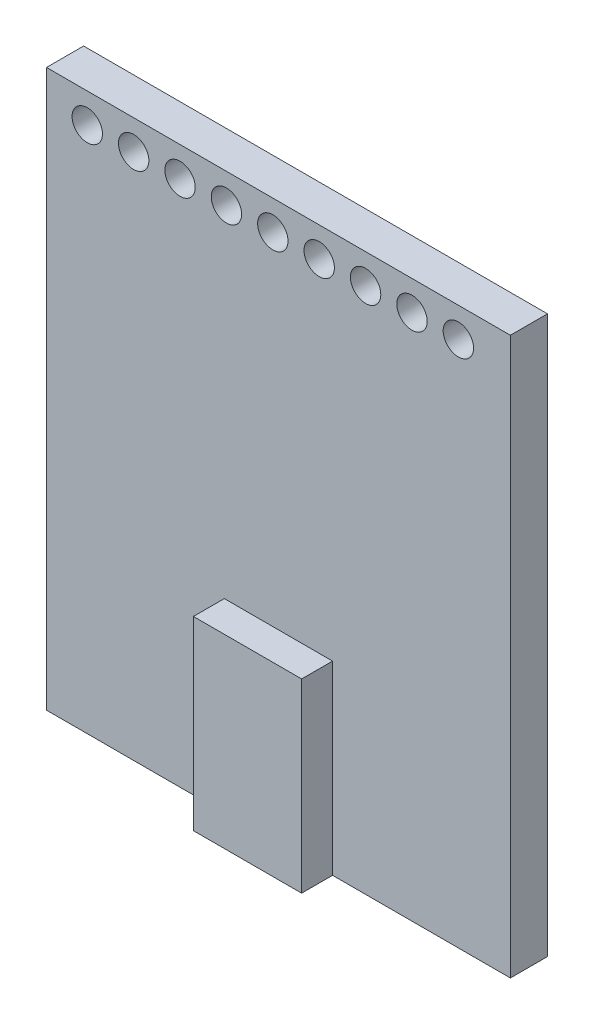
ISO-10303-21;
HEADER;
FILE_DESCRIPTION(('STEP AP214'),'2;1');
FILE_NAME('part.step','',(''),(''),'','','');
FILE_SCHEMA(('AUTOMOTIVE_DESIGN { 1 0 10303 214 1 1 1 1 }'));
ENDSEC;
DATA;
#1=APPLICATION_CONTEXT('core data for automotive mechanical design processes');
#2=APPLICATION_PROTOCOL_DEFINITION('international standard','automotive_design',2000,#1);
#3=PRODUCT_CONTEXT('',#1,'mechanical');
#4=PRODUCT('Part','Part','',(#3));
#5=PRODUCT_RELATED_PRODUCT_CATEGORY('part','',(#4));
#6=PRODUCT_DEFINITION_FORMATION('','',#4);
#7=PRODUCT_DEFINITION_CONTEXT('part definition',#1,'design');
#8=PRODUCT_DEFINITION('design','',#6,#7);
#9=PRODUCT_DEFINITION_SHAPE('','',#8);
#10=(LENGTH_UNIT() NAMED_UNIT(*) SI_UNIT(.MILLI.,.METRE.));
#11=(NAMED_UNIT(*) PLANE_ANGLE_UNIT() SI_UNIT($,.RADIAN.));
#12=(NAMED_UNIT(*) SI_UNIT($,.STERADIAN.) SOLID_ANGLE_UNIT());
#13=UNCERTAINTY_MEASURE_WITH_UNIT(LENGTH_MEASURE(1.E-05),#10,'distance_accuracy_value','');
#14=(GEOMETRIC_REPRESENTATION_CONTEXT(3) GLOBAL_UNCERTAINTY_ASSIGNED_CONTEXT((#13)) GLOBAL_UNIT_ASSIGNED_CONTEXT((#10,
#11,#12)) REPRESENTATION_CONTEXT('',''));
#15=CARTESIAN_POINT('',(0.,0.,0.));
#16=DIRECTION('',(0.,0.,1.));
#17=DIRECTION('',(1.,0.,0.));
#18=AXIS2_PLACEMENT_3D('',#15,#16,#17);
#19=CARTESIAN_POINT('',(7.5,9.,1.2));
#20=DIRECTION('',(-1.,0.,0.));
#21=DIRECTION('',(0.,-1.,0.));
#22=AXIS2_PLACEMENT_3D('',#19,#20,#21);
#23=PLANE('',#22);
#24=DIRECTION('',(0.,1.,0.));
#25=VECTOR('',#24,1.);
#26=CARTESIAN_POINT('',(7.5,9.,0.));
#27=LINE('',#26,#25);
#28=CARTESIAN_POINT('',(7.5,-9.,0.));
#29=VERTEX_POINT('',#28);
#30=CARTESIAN_POINT('',(7.5,9.,0.));
#31=VERTEX_POINT('',#30);
#32=EDGE_CURVE('E129',#29,#31,#27,.T.);
#33=ORIENTED_EDGE('',*,*,#32,.T.);
#34=DIRECTION('',(0.,0.,-1.));
#35=VECTOR('',#34,1.);
#36=CARTESIAN_POINT('',(7.5,9.,1.2));
#37=LINE('',#36,#35);
#38=CARTESIAN_POINT('',(7.5,9.,1.2));
#39=VERTEX_POINT('',#38);
#40=EDGE_CURVE('E11',#39,#31,#37,.T.);
#41=ORIENTED_EDGE('',*,*,#40,.F.);
#42=DIRECTION('',(0.,1.,0.));
#43=VECTOR('',#42,1.);
#44=CARTESIAN_POINT('',(7.5,9.,1.2));
#45=LINE('',#44,#43);
#46=CARTESIAN_POINT('',(7.5,-9.,1.2));
#47=VERTEX_POINT('',#46);
#48=EDGE_CURVE('E140',#47,#39,#45,.T.);
#49=ORIENTED_EDGE('',*,*,#48,.F.);
#50=DIRECTION('',(0.,0.,-1.));
#51=VECTOR('',#50,1.);
#52=CARTESIAN_POINT('',(7.5,-9.,1.2));
#53=LINE('',#52,#51);
#54=EDGE_CURVE('E154',#47,#29,#53,.T.);
#55=ORIENTED_EDGE('',*,*,#54,.T.);
#56=EDGE_LOOP('',(#33,#41,#49,#55));
#57=FACE_BOUND('',#56,.T.);
#58=ADVANCED_FACE('F39',(#57),#23,.F.);
#59=CARTESIAN_POINT('',(-7.5,9.,1.2));
#60=DIRECTION('',(0.,-1.,0.));
#61=DIRECTION('',(0.,0.,-1.));
#62=AXIS2_PLACEMENT_3D('',#59,#60,#61);
#63=PLANE('',#62);
#64=DIRECTION('',(-1.,0.,0.));
#65=VECTOR('',#64,1.);
#66=CARTESIAN_POINT('',(-7.5,9.,0.));
#67=LINE('',#66,#65);
#68=CARTESIAN_POINT('',(-7.5,9.,0.));
#69=VERTEX_POINT('',#68);
#70=EDGE_CURVE('E134',#31,#69,#67,.T.);
#71=ORIENTED_EDGE('',*,*,#70,.T.);
#72=DIRECTION('',(0.,0.,-1.));
#73=VECTOR('',#72,1.);
#74=CARTESIAN_POINT('',(-7.5,9.,1.2));
#75=LINE('',#74,#73);
#76=CARTESIAN_POINT('',(-7.5,9.,1.2));
#77=VERTEX_POINT('',#76);
#78=EDGE_CURVE('E47',#77,#69,#75,.T.);
#79=ORIENTED_EDGE('',*,*,#78,.F.);
#80=DIRECTION('',(-1.,0.,0.));
#81=VECTOR('',#80,1.);
#82=CARTESIAN_POINT('',(-7.5,9.,1.2));
#83=LINE('',#82,#81);
#84=EDGE_CURVE('E144',#39,#77,#83,.T.);
#85=ORIENTED_EDGE('',*,*,#84,.F.);
#86=ORIENTED_EDGE('',*,*,#40,.T.);
#87=EDGE_LOOP('',(#71,#79,#85,#86));
#88=FACE_BOUND('',#87,.T.);
#89=ADVANCED_FACE('F219',(#88),#63,.F.);
#90=CARTESIAN_POINT('',(-7.5,9.,1.2));
#91=DIRECTION('',(1.,0.,0.));
#92=DIRECTION('',(0.,1.,0.));
#93=AXIS2_PLACEMENT_3D('',#90,#91,#92);
#94=PLANE('',#93);
#95=DIRECTION('',(0.,-1.,0.));
#96=VECTOR('',#95,1.);
#97=CARTESIAN_POINT('',(-7.5,9.,0.));
#98=LINE('',#97,#96);
#99=CARTESIAN_POINT('',(-7.5,-9.,0.));
#100=VERTEX_POINT('',#99);
#101=EDGE_CURVE('E158',#69,#100,#98,.T.);
#102=ORIENTED_EDGE('',*,*,#101,.T.);
#103=DIRECTION('',(0.,0.,-1.));
#104=VECTOR('',#103,1.);
#105=CARTESIAN_POINT('',(-7.5,-9.,1.2));
#106=LINE('',#105,#104);
#107=CARTESIAN_POINT('',(-7.5,-9.,1.2));
#108=VERTEX_POINT('',#107);
#109=EDGE_CURVE('E166',#108,#100,#106,.T.);
#110=ORIENTED_EDGE('',*,*,#109,.F.);
#111=DIRECTION('',(0.,-1.,0.));
#112=VECTOR('',#111,1.);
#113=CARTESIAN_POINT('',(-7.5,9.,1.2));
#114=LINE('',#113,#112);
#115=EDGE_CURVE('E148',#77,#108,#114,.T.);
#116=ORIENTED_EDGE('',*,*,#115,.F.);
#117=ORIENTED_EDGE('',*,*,#78,.T.);
#118=EDGE_LOOP('',(#102,#110,#116,#117));
#119=FACE_BOUND('',#118,.T.);
#120=ADVANCED_FACE('F175',(#119),#94,.F.);
#121=CARTESIAN_POINT('',(-7.5,-9.,1.2));
#122=DIRECTION('',(0.,1.,0.));
#123=DIRECTION('',(0.,0.,1.));
#124=AXIS2_PLACEMENT_3D('',#121,#122,#123);
#125=PLANE('',#124);
#126=DIRECTION('',(1.,0.,0.));
#127=VECTOR('',#126,1.);
#128=CARTESIAN_POINT('',(-7.5,-9.,0.));
#129=LINE('',#128,#127);
#130=EDGE_CURVE('E145',#100,#29,#129,.T.);
#131=ORIENTED_EDGE('',*,*,#130,.T.);
#132=ORIENTED_EDGE('',*,*,#54,.F.);
#133=DIRECTION('',(1.,0.,0.));
#134=VECTOR('',#133,1.);
#135=CARTESIAN_POINT('',(-7.5,-9.,1.2));
#136=LINE('',#135,#134);
#137=CARTESIAN_POINT('',(1.75,-9.,1.2));
#138=VERTEX_POINT('',#137);
#139=EDGE_CURVE('E151',#138,#47,#136,.T.);
#140=ORIENTED_EDGE('',*,*,#139,.F.);
#141=DIRECTION('',(0.,0.,-1.));
#142=VECTOR('',#141,1.);
#143=CARTESIAN_POINT('',(1.75,-9.,2.2));
#144=LINE('',#143,#142);
#145=CARTESIAN_POINT('',(1.75,-9.,2.2));
#146=VERTEX_POINT('',#145);
#147=EDGE_CURVE('E110',#146,#138,#144,.T.);
#148=ORIENTED_EDGE('',*,*,#147,.F.);
#149=DIRECTION('',(1.,0.,0.));
#150=VECTOR('',#149,1.);
#151=CARTESIAN_POINT('',(-1.75,-9.,2.2));
#152=LINE('',#151,#150);
#153=CARTESIAN_POINT('',(-1.75,-9.,2.2));
#154=VERTEX_POINT('',#153);
#155=EDGE_CURVE('E103',#154,#146,#152,.T.);
#156=ORIENTED_EDGE('',*,*,#155,.F.);
#157=DIRECTION('',(0.,0.,-1.));
#158=VECTOR('',#157,1.);
#159=CARTESIAN_POINT('',(-1.75,-9.,2.2));
#160=LINE('',#159,#158);
#161=CARTESIAN_POINT('',(-1.75,-9.,1.2));
#162=VERTEX_POINT('',#161);
#163=EDGE_CURVE('E108',#154,#162,#160,.T.);
#164=ORIENTED_EDGE('',*,*,#163,.T.);
#165=EDGE_CURVE('E152',#108,#162,#136,.T.);
#166=ORIENTED_EDGE('',*,*,#165,.F.);
#167=ORIENTED_EDGE('',*,*,#109,.T.);
#168=EDGE_LOOP('',(#131,#132,#140,#148,#156,#164,#166,#167));
#169=FACE_BOUND('',#168,.T.);
#170=ADVANCED_FACE('F105',(#169),#125,.F.);
#171=CARTESIAN_POINT('',(0.,0.,1.2));
#172=DIRECTION('',(0.,0.,1.));
#173=DIRECTION('',(1.,0.,0.));
#174=AXIS2_PLACEMENT_3D('',#171,#172,#173);
#175=PLANE('',#174);
#176=CARTESIAN_POINT('',(-6.18190724480883,8.04141873814679,1.2));
#177=DIRECTION('',(0.,0.,1.));
#178=DIRECTION('',(1.,0.,0.));
#179=AXIS2_PLACEMENT_3D('',#176,#177,#178);
#180=CIRCLE('',#179,0.491511220984585);
#181=CARTESIAN_POINT('',(-5.69039602382424,8.04141873814679,1.2));
#182=VERTEX_POINT('',#181);
#183=EDGE_CURVE('E449',#182,#182,#180,.T.);
#184=ORIENTED_EDGE('',*,*,#183,.F.);
#185=EDGE_LOOP('',(#184));
#186=FACE_BOUND('',#185,.T.);
#187=CARTESIAN_POINT('',(-4.68190724480883,8.04141873814679,1.2));
#188=DIRECTION('',(0.,0.,1.));
#189=DIRECTION('',(1.,0.,0.));
#190=AXIS2_PLACEMENT_3D('',#187,#188,#189);
#191=CIRCLE('',#190,0.491511220984585);
#192=CARTESIAN_POINT('',(-4.19039602382424,8.04141873814679,1.2));
#193=VERTEX_POINT('',#192);
#194=EDGE_CURVE('E459',#193,#193,#191,.T.);
#195=ORIENTED_EDGE('',*,*,#194,.F.);
#196=EDGE_LOOP('',(#195));
#197=FACE_BOUND('',#196,.T.);
#198=CARTESIAN_POINT('',(-3.18190724480883,8.04141873814679,1.2));
#199=DIRECTION('',(0.,0.,1.));
#200=DIRECTION('',(1.,0.,0.));
#201=AXIS2_PLACEMENT_3D('',#198,#199,#200);
#202=CIRCLE('',#201,0.491511220984585);
#203=CARTESIAN_POINT('',(-2.69039602382424,8.04141873814679,1.2));
#204=VERTEX_POINT('',#203);
#205=EDGE_CURVE('E467',#204,#204,#202,.T.);
#206=ORIENTED_EDGE('',*,*,#205,.F.);
#207=EDGE_LOOP('',(#206));
#208=FACE_BOUND('',#207,.T.);
#209=CARTESIAN_POINT('',(-1.68190724480883,8.04141873814679,1.2));
#210=DIRECTION('',(0.,0.,1.));
#211=DIRECTION('',(1.,0.,0.));
#212=AXIS2_PLACEMENT_3D('',#209,#210,#211);
#213=CIRCLE('',#212,0.491511220984585);
#214=CARTESIAN_POINT('',(-1.19039602382424,8.04141873814679,1.2));
#215=VERTEX_POINT('',#214);
#216=EDGE_CURVE('E475',#215,#215,#213,.T.);
#217=ORIENTED_EDGE('',*,*,#216,.F.);
#218=EDGE_LOOP('',(#217));
#219=FACE_BOUND('',#218,.T.);
#220=CARTESIAN_POINT('',(-0.181907244808826,8.04141873814679,1.2));
#221=DIRECTION('',(0.,0.,1.));
#222=DIRECTION('',(1.,0.,0.));
#223=AXIS2_PLACEMENT_3D('',#220,#221,#222);
#224=CIRCLE('',#223,0.491511220984585);
#225=CARTESIAN_POINT('',(0.309603976175758,8.04141873814679,1.2));
#226=VERTEX_POINT('',#225);
#227=EDGE_CURVE('E483',#226,#226,#224,.T.);
#228=ORIENTED_EDGE('',*,*,#227,.F.);
#229=EDGE_LOOP('',(#228));
#230=FACE_BOUND('',#229,.T.);
#231=CARTESIAN_POINT('',(1.31809275519117,8.04141873814679,1.2));
#232=DIRECTION('',(0.,0.,1.));
#233=DIRECTION('',(1.,0.,0.));
#234=AXIS2_PLACEMENT_3D('',#231,#232,#233);
#235=CIRCLE('',#234,0.491511220984585);
#236=CARTESIAN_POINT('',(1.80960397617576,8.04141873814679,1.2));
#237=VERTEX_POINT('',#236);
#238=EDGE_CURVE('E491',#237,#237,#235,.T.);
#239=ORIENTED_EDGE('',*,*,#238,.F.);
#240=EDGE_LOOP('',(#239));
#241=FACE_BOUND('',#240,.T.);
#242=CARTESIAN_POINT('',(2.81809275519117,8.04141873814679,1.2));
#243=DIRECTION('',(0.,0.,1.));
#244=DIRECTION('',(1.,0.,0.));
#245=AXIS2_PLACEMENT_3D('',#242,#243,#244);
#246=CIRCLE('',#245,0.491511220984585);
#247=CARTESIAN_POINT('',(3.30960397617576,8.04141873814679,1.2));
#248=VERTEX_POINT('',#247);
#249=EDGE_CURVE('E499',#248,#248,#246,.T.);
#250=ORIENTED_EDGE('',*,*,#249,.F.);
#251=EDGE_LOOP('',(#250));
#252=FACE_BOUND('',#251,.T.);
#253=CARTESIAN_POINT('',(4.31809275519117,8.04141873814679,1.2));
#254=DIRECTION('',(0.,0.,1.));
#255=DIRECTION('',(1.,0.,0.));
#256=AXIS2_PLACEMENT_3D('',#253,#254,#255);
#257=CIRCLE('',#256,0.491511220984585);
#258=CARTESIAN_POINT('',(4.80960397617576,8.04141873814679,1.2));
#259=VERTEX_POINT('',#258);
#260=EDGE_CURVE('E507',#259,#259,#257,.T.);
#261=ORIENTED_EDGE('',*,*,#260,.F.);
#262=EDGE_LOOP('',(#261));
#263=FACE_BOUND('',#262,.T.);
#264=CARTESIAN_POINT('',(5.81809275519117,8.04141873814679,1.2));
#265=DIRECTION('',(0.,0.,1.));
#266=DIRECTION('',(1.,0.,0.));
#267=AXIS2_PLACEMENT_3D('',#264,#265,#266);
#268=CIRCLE('',#267,0.491511220984585);
#269=CARTESIAN_POINT('',(6.30960397617576,8.04141873814679,1.2));
#270=VERTEX_POINT('',#269);
#271=EDGE_CURVE('E515',#270,#270,#268,.T.);
#272=ORIENTED_EDGE('',*,*,#271,.F.);
#273=EDGE_LOOP('',(#272));
#274=FACE_BOUND('',#273,.T.);
#275=DIRECTION('',(0.,-1.,0.));
#276=VECTOR('',#275,1.);
#277=CARTESIAN_POINT('',(-1.75,-9.,1.2));
#278=LINE('',#277,#276);
#279=CARTESIAN_POINT('',(-1.75,-3.,1.2));
#280=VERTEX_POINT('',#279);
#281=EDGE_CURVE('E54',#280,#162,#278,.T.);
#282=ORIENTED_EDGE('',*,*,#281,.F.);
#283=DIRECTION('',(-1.,0.,0.));
#284=VECTOR('',#283,1.);
#285=CARTESIAN_POINT('',(-1.75,-3.,1.2));
#286=LINE('',#285,#284);
#287=CARTESIAN_POINT('',(1.75,-3.,1.2));
#288=VERTEX_POINT('',#287);
#289=EDGE_CURVE('E125',#288,#280,#286,.T.);
#290=ORIENTED_EDGE('',*,*,#289,.F.);
#291=DIRECTION('',(0.,1.,0.));
#292=VECTOR('',#291,1.);
#293=CARTESIAN_POINT('',(1.75,-9.,1.2));
#294=LINE('',#293,#292);
#295=EDGE_CURVE('E60',#138,#288,#294,.T.);
#296=ORIENTED_EDGE('',*,*,#295,.F.);
#297=ORIENTED_EDGE('',*,*,#139,.T.);
#298=ORIENTED_EDGE('',*,*,#48,.T.);
#299=ORIENTED_EDGE('',*,*,#84,.T.);
#300=ORIENTED_EDGE('',*,*,#115,.T.);
#301=ORIENTED_EDGE('',*,*,#165,.T.);
#302=EDGE_LOOP('',(#282,#290,#296,#297,#298,#299,#300,#301));
#303=FACE_BOUND('',#302,.T.);
#304=ADVANCED_FACE('F186',(#186,#197,#208,#219,#230,#241,#252,#263,#274,#303),#175,.T.);
#305=CARTESIAN_POINT('',(0.,0.,0.));
#306=DIRECTION('',(0.,0.,1.));
#307=DIRECTION('',(1.,0.,0.));
#308=AXIS2_PLACEMENT_3D('',#305,#306,#307);
#309=PLANE('',#308);
#310=ORIENTED_EDGE('',*,*,#32,.F.);
#311=ORIENTED_EDGE('',*,*,#130,.F.);
#312=ORIENTED_EDGE('',*,*,#101,.F.);
#313=ORIENTED_EDGE('',*,*,#70,.F.);
#314=EDGE_LOOP('',(#310,#311,#312,#313));
#315=FACE_BOUND('',#314,.T.);
#316=ADVANCED_FACE('F181',(#315),#309,.F.);
#317=CARTESIAN_POINT('',(-1.75,-9.,2.2));
#318=DIRECTION('',(1.,0.,0.));
#319=DIRECTION('',(0.,0.,-1.));
#320=AXIS2_PLACEMENT_3D('',#317,#318,#319);
#321=PLANE('',#320);
#322=ORIENTED_EDGE('',*,*,#281,.T.);
#323=ORIENTED_EDGE('',*,*,#163,.F.);
#324=DIRECTION('',(0.,-1.,0.));
#325=VECTOR('',#324,1.);
#326=CARTESIAN_POINT('',(-1.75,-9.,2.2));
#327=LINE('',#326,#325);
#328=CARTESIAN_POINT('',(-1.75,-3.,2.2));
#329=VERTEX_POINT('',#328);
#330=EDGE_CURVE('E115',#329,#154,#327,.T.);
#331=ORIENTED_EDGE('',*,*,#330,.F.);
#332=DIRECTION('',(0.,0.,-1.));
#333=VECTOR('',#332,1.);
#334=CARTESIAN_POINT('',(-1.75,-3.,2.2));
#335=LINE('',#334,#333);
#336=EDGE_CURVE('E195',#329,#280,#335,.T.);
#337=ORIENTED_EDGE('',*,*,#336,.T.);
#338=EDGE_LOOP('',(#322,#323,#331,#337));
#339=FACE_BOUND('',#338,.T.);
#340=ADVANCED_FACE('F127',(#339),#321,.F.);
#341=CARTESIAN_POINT('',(1.75,-9.,2.2));
#342=DIRECTION('',(-1.,0.,0.));
#343=DIRECTION('',(0.,0.,1.));
#344=AXIS2_PLACEMENT_3D('',#341,#342,#343);
#345=PLANE('',#344);
#346=ORIENTED_EDGE('',*,*,#295,.T.);
#347=DIRECTION('',(0.,0.,-1.));
#348=VECTOR('',#347,1.);
#349=CARTESIAN_POINT('',(1.75,-3.,2.2));
#350=LINE('',#349,#348);
#351=CARTESIAN_POINT('',(1.75,-3.,2.2));
#352=VERTEX_POINT('',#351);
#353=EDGE_CURVE('E136',#352,#288,#350,.T.);
#354=ORIENTED_EDGE('',*,*,#353,.F.);
#355=DIRECTION('',(0.,1.,0.));
#356=VECTOR('',#355,1.);
#357=CARTESIAN_POINT('',(1.75,-9.,2.2));
#358=LINE('',#357,#356);
#359=EDGE_CURVE('E114',#146,#352,#358,.T.);
#360=ORIENTED_EDGE('',*,*,#359,.F.);
#361=ORIENTED_EDGE('',*,*,#147,.T.);
#362=EDGE_LOOP('',(#346,#354,#360,#361));
#363=FACE_BOUND('',#362,.T.);
#364=ADVANCED_FACE('F189',(#363),#345,.F.);
#365=CARTESIAN_POINT('',(-1.75,-3.,2.2));
#366=DIRECTION('',(0.,-1.,0.));
#367=DIRECTION('',(0.,0.,-1.));
#368=AXIS2_PLACEMENT_3D('',#365,#366,#367);
#369=PLANE('',#368);
#370=ORIENTED_EDGE('',*,*,#289,.T.);
#371=ORIENTED_EDGE('',*,*,#336,.F.);
#372=DIRECTION('',(-1.,0.,0.));
#373=VECTOR('',#372,1.);
#374=CARTESIAN_POINT('',(-1.75,-3.,2.2));
#375=LINE('',#374,#373);
#376=EDGE_CURVE('E120',#352,#329,#375,.T.);
#377=ORIENTED_EDGE('',*,*,#376,.F.);
#378=ORIENTED_EDGE('',*,*,#353,.T.);
#379=EDGE_LOOP('',(#370,#371,#377,#378));
#380=FACE_BOUND('',#379,.T.);
#381=ADVANCED_FACE('F208',(#380),#369,.F.);
#382=CARTESIAN_POINT('',(0.,0.,2.2));
#383=DIRECTION('',(0.,0.,-1.));
#384=DIRECTION('',(-1.,0.,0.));
#385=AXIS2_PLACEMENT_3D('',#382,#383,#384);
#386=PLANE('',#385);
#387=ORIENTED_EDGE('',*,*,#330,.T.);
#388=ORIENTED_EDGE('',*,*,#155,.T.);
#389=ORIENTED_EDGE('',*,*,#359,.T.);
#390=ORIENTED_EDGE('',*,*,#376,.T.);
#391=EDGE_LOOP('',(#387,#388,#389,#390));
#392=FACE_BOUND('',#391,.T.);
#393=ADVANCED_FACE('F118',(#392),#386,.F.);
#394=CARTESIAN_POINT('',(5.81809275519117,8.04141873814679,0.2));
#395=DIRECTION('',(0.,0.,1.));
#396=DIRECTION('',(1.,0.,0.));
#397=AXIS2_PLACEMENT_3D('',#394,#395,#396);
#398=CYLINDRICAL_SURFACE('',#397,0.491511220984585);
#399=CARTESIAN_POINT('',(5.81809275519117,8.04141873814679,0.2));
#400=DIRECTION('',(0.,0.,1.));
#401=DIRECTION('',(1.,0.,0.));
#402=AXIS2_PLACEMENT_3D('',#399,#400,#401);
#403=CIRCLE('',#402,0.491511220984585);
#404=CARTESIAN_POINT('',(6.30960397617576,8.04141873814679,0.2));
#405=VERTEX_POINT('',#404);
#406=EDGE_CURVE('E511',#405,#405,#403,.T.);
#407=ORIENTED_EDGE('',*,*,#406,.F.);
#408=EDGE_LOOP('',(#407));
#409=FACE_BOUND('',#408,.T.);
#410=ORIENTED_EDGE('',*,*,#271,.T.);
#411=EDGE_LOOP('',(#410));
#412=FACE_BOUND('',#411,.T.);
#413=ADVANCED_FACE('F215',(#409,#412),#398,.F.);
#414=CARTESIAN_POINT('',(5.81809275519117,8.04141873814679,0.2));
#415=DIRECTION('',(0.,0.,1.));
#416=DIRECTION('',(1.,0.,0.));
#417=AXIS2_PLACEMENT_3D('',#414,#415,#416);
#418=PLANE('',#417);
#419=ORIENTED_EDGE('',*,*,#406,.T.);
#420=EDGE_LOOP('',(#419));
#421=FACE_BOUND('',#420,.T.);
#422=ADVANCED_FACE('F272',(#421),#418,.T.);
#423=CARTESIAN_POINT('',(4.31809275519117,8.04141873814679,0.2));
#424=DIRECTION('',(0.,0.,1.));
#425=DIRECTION('',(1.,0.,0.));
#426=AXIS2_PLACEMENT_3D('',#423,#424,#425);
#427=CYLINDRICAL_SURFACE('',#426,0.491511220984585);
#428=CARTESIAN_POINT('',(4.31809275519117,8.04141873814679,0.2));
#429=DIRECTION('',(0.,0.,1.));
#430=DIRECTION('',(1.,0.,0.));
#431=AXIS2_PLACEMENT_3D('',#428,#429,#430);
#432=CIRCLE('',#431,0.491511220984585);
#433=CARTESIAN_POINT('',(4.80960397617576,8.04141873814679,0.2));
#434=VERTEX_POINT('',#433);
#435=EDGE_CURVE('E503',#434,#434,#432,.T.);
#436=ORIENTED_EDGE('',*,*,#435,.F.);
#437=EDGE_LOOP('',(#436));
#438=FACE_BOUND('',#437,.T.);
#439=ORIENTED_EDGE('',*,*,#260,.T.);
#440=EDGE_LOOP('',(#439));
#441=FACE_BOUND('',#440,.T.);
#442=ADVANCED_FACE('F282',(#438,#441),#427,.F.);
#443=CARTESIAN_POINT('',(4.31809275519117,8.04141873814679,0.2));
#444=DIRECTION('',(0.,0.,1.));
#445=DIRECTION('',(1.,0.,0.));
#446=AXIS2_PLACEMENT_3D('',#443,#444,#445);
#447=PLANE('',#446);
#448=ORIENTED_EDGE('',*,*,#435,.T.);
#449=EDGE_LOOP('',(#448));
#450=FACE_BOUND('',#449,.T.);
#451=ADVANCED_FACE('F292',(#450),#447,.T.);
#452=CARTESIAN_POINT('',(2.81809275519117,8.04141873814679,0.2));
#453=DIRECTION('',(0.,0.,1.));
#454=DIRECTION('',(1.,0.,0.));
#455=AXIS2_PLACEMENT_3D('',#452,#453,#454);
#456=CYLINDRICAL_SURFACE('',#455,0.491511220984585);
#457=CARTESIAN_POINT('',(2.81809275519117,8.04141873814679,0.2));
#458=DIRECTION('',(0.,0.,1.));
#459=DIRECTION('',(1.,0.,0.));
#460=AXIS2_PLACEMENT_3D('',#457,#458,#459);
#461=CIRCLE('',#460,0.491511220984585);
#462=CARTESIAN_POINT('',(3.30960397617576,8.04141873814679,0.2));
#463=VERTEX_POINT('',#462);
#464=EDGE_CURVE('E495',#463,#463,#461,.T.);
#465=ORIENTED_EDGE('',*,*,#464,.F.);
#466=EDGE_LOOP('',(#465));
#467=FACE_BOUND('',#466,.T.);
#468=ORIENTED_EDGE('',*,*,#249,.T.);
#469=EDGE_LOOP('',(#468));
#470=FACE_BOUND('',#469,.T.);
#471=ADVANCED_FACE('F302',(#467,#470),#456,.F.);
#472=CARTESIAN_POINT('',(2.81809275519117,8.04141873814679,0.2));
#473=DIRECTION('',(0.,0.,1.));
#474=DIRECTION('',(1.,0.,0.));
#475=AXIS2_PLACEMENT_3D('',#472,#473,#474);
#476=PLANE('',#475);
#477=ORIENTED_EDGE('',*,*,#464,.T.);
#478=EDGE_LOOP('',(#477));
#479=FACE_BOUND('',#478,.T.);
#480=ADVANCED_FACE('F312',(#479),#476,.T.);
#481=CARTESIAN_POINT('',(1.31809275519117,8.04141873814679,0.2));
#482=DIRECTION('',(0.,0.,1.));
#483=DIRECTION('',(1.,0.,0.));
#484=AXIS2_PLACEMENT_3D('',#481,#482,#483);
#485=CYLINDRICAL_SURFACE('',#484,0.491511220984585);
#486=CARTESIAN_POINT('',(1.31809275519117,8.04141873814679,0.2));
#487=DIRECTION('',(0.,0.,1.));
#488=DIRECTION('',(1.,0.,0.));
#489=AXIS2_PLACEMENT_3D('',#486,#487,#488);
#490=CIRCLE('',#489,0.491511220984585);
#491=CARTESIAN_POINT('',(1.80960397617576,8.04141873814679,0.2));
#492=VERTEX_POINT('',#491);
#493=EDGE_CURVE('E487',#492,#492,#490,.T.);
#494=ORIENTED_EDGE('',*,*,#493,.F.);
#495=EDGE_LOOP('',(#494));
#496=FACE_BOUND('',#495,.T.);
#497=ORIENTED_EDGE('',*,*,#238,.T.);
#498=EDGE_LOOP('',(#497));
#499=FACE_BOUND('',#498,.T.);
#500=ADVANCED_FACE('F322',(#496,#499),#485,.F.);
#501=CARTESIAN_POINT('',(1.31809275519117,8.04141873814679,0.2));
#502=DIRECTION('',(0.,0.,1.));
#503=DIRECTION('',(1.,0.,0.));
#504=AXIS2_PLACEMENT_3D('',#501,#502,#503);
#505=PLANE('',#504);
#506=ORIENTED_EDGE('',*,*,#493,.T.);
#507=EDGE_LOOP('',(#506));
#508=FACE_BOUND('',#507,.T.);
#509=ADVANCED_FACE('F332',(#508),#505,.T.);
#510=CARTESIAN_POINT('',(-0.181907244808826,8.04141873814679,0.2));
#511=DIRECTION('',(0.,0.,1.));
#512=DIRECTION('',(1.,0.,0.));
#513=AXIS2_PLACEMENT_3D('',#510,#511,#512);
#514=CYLINDRICAL_SURFACE('',#513,0.491511220984585);
#515=CARTESIAN_POINT('',(-0.181907244808826,8.04141873814679,0.2));
#516=DIRECTION('',(0.,0.,1.));
#517=DIRECTION('',(1.,0.,0.));
#518=AXIS2_PLACEMENT_3D('',#515,#516,#517);
#519=CIRCLE('',#518,0.491511220984585);
#520=CARTESIAN_POINT('',(0.309603976175758,8.04141873814679,0.2));
#521=VERTEX_POINT('',#520);
#522=EDGE_CURVE('E479',#521,#521,#519,.T.);
#523=ORIENTED_EDGE('',*,*,#522,.F.);
#524=EDGE_LOOP('',(#523));
#525=FACE_BOUND('',#524,.T.);
#526=ORIENTED_EDGE('',*,*,#227,.T.);
#527=EDGE_LOOP('',(#526));
#528=FACE_BOUND('',#527,.T.);
#529=ADVANCED_FACE('F342',(#525,#528),#514,.F.);
#530=CARTESIAN_POINT('',(-0.181907244808826,8.04141873814679,0.2));
#531=DIRECTION('',(0.,0.,1.));
#532=DIRECTION('',(1.,0.,0.));
#533=AXIS2_PLACEMENT_3D('',#530,#531,#532);
#534=PLANE('',#533);
#535=ORIENTED_EDGE('',*,*,#522,.T.);
#536=EDGE_LOOP('',(#535));
#537=FACE_BOUND('',#536,.T.);
#538=ADVANCED_FACE('F352',(#537),#534,.T.);
#539=CARTESIAN_POINT('',(-1.68190724480883,8.04141873814679,0.2));
#540=DIRECTION('',(0.,0.,1.));
#541=DIRECTION('',(1.,0.,0.));
#542=AXIS2_PLACEMENT_3D('',#539,#540,#541);
#543=CYLINDRICAL_SURFACE('',#542,0.491511220984585);
#544=CARTESIAN_POINT('',(-1.68190724480883,8.04141873814679,0.2));
#545=DIRECTION('',(0.,0.,1.));
#546=DIRECTION('',(1.,0.,0.));
#547=AXIS2_PLACEMENT_3D('',#544,#545,#546);
#548=CIRCLE('',#547,0.491511220984585);
#549=CARTESIAN_POINT('',(-1.19039602382424,8.04141873814679,0.2));
#550=VERTEX_POINT('',#549);
#551=EDGE_CURVE('E471',#550,#550,#548,.T.);
#552=ORIENTED_EDGE('',*,*,#551,.F.);
#553=EDGE_LOOP('',(#552));
#554=FACE_BOUND('',#553,.T.);
#555=ORIENTED_EDGE('',*,*,#216,.T.);
#556=EDGE_LOOP('',(#555));
#557=FACE_BOUND('',#556,.T.);
#558=ADVANCED_FACE('F362',(#554,#557),#543,.F.);
#559=CARTESIAN_POINT('',(-1.68190724480883,8.04141873814679,0.2));
#560=DIRECTION('',(0.,0.,1.));
#561=DIRECTION('',(1.,0.,0.));
#562=AXIS2_PLACEMENT_3D('',#559,#560,#561);
#563=PLANE('',#562);
#564=ORIENTED_EDGE('',*,*,#551,.T.);
#565=EDGE_LOOP('',(#564));
#566=FACE_BOUND('',#565,.T.);
#567=ADVANCED_FACE('F372',(#566),#563,.T.);
#568=CARTESIAN_POINT('',(-3.18190724480883,8.04141873814679,0.2));
#569=DIRECTION('',(0.,0.,1.));
#570=DIRECTION('',(1.,0.,0.));
#571=AXIS2_PLACEMENT_3D('',#568,#569,#570);
#572=CYLINDRICAL_SURFACE('',#571,0.491511220984585);
#573=CARTESIAN_POINT('',(-3.18190724480883,8.04141873814679,0.2));
#574=DIRECTION('',(0.,0.,1.));
#575=DIRECTION('',(1.,0.,0.));
#576=AXIS2_PLACEMENT_3D('',#573,#574,#575);
#577=CIRCLE('',#576,0.491511220984585);
#578=CARTESIAN_POINT('',(-2.69039602382424,8.04141873814679,0.2));
#579=VERTEX_POINT('',#578);
#580=EDGE_CURVE('E463',#579,#579,#577,.T.);
#581=ORIENTED_EDGE('',*,*,#580,.F.);
#582=EDGE_LOOP('',(#581));
#583=FACE_BOUND('',#582,.T.);
#584=ORIENTED_EDGE('',*,*,#205,.T.);
#585=EDGE_LOOP('',(#584));
#586=FACE_BOUND('',#585,.T.);
#587=ADVANCED_FACE('F382',(#583,#586),#572,.F.);
#588=CARTESIAN_POINT('',(-3.18190724480883,8.04141873814679,0.2));
#589=DIRECTION('',(0.,0.,1.));
#590=DIRECTION('',(1.,0.,0.));
#591=AXIS2_PLACEMENT_3D('',#588,#589,#590);
#592=PLANE('',#591);
#593=ORIENTED_EDGE('',*,*,#580,.T.);
#594=EDGE_LOOP('',(#593));
#595=FACE_BOUND('',#594,.T.);
#596=ADVANCED_FACE('F392',(#595),#592,.T.);
#597=CARTESIAN_POINT('',(-4.68190724480883,8.04141873814679,0.2));
#598=DIRECTION('',(0.,0.,1.));
#599=DIRECTION('',(1.,0.,0.));
#600=AXIS2_PLACEMENT_3D('',#597,#598,#599);
#601=CYLINDRICAL_SURFACE('',#600,0.491511220984585);
#602=CARTESIAN_POINT('',(-4.68190724480883,8.04141873814679,0.2));
#603=DIRECTION('',(0.,0.,1.));
#604=DIRECTION('',(1.,0.,0.));
#605=AXIS2_PLACEMENT_3D('',#602,#603,#604);
#606=CIRCLE('',#605,0.491511220984585);
#607=CARTESIAN_POINT('',(-4.19039602382424,8.04141873814679,0.2));
#608=VERTEX_POINT('',#607);
#609=EDGE_CURVE('E453',#608,#608,#606,.T.);
#610=ORIENTED_EDGE('',*,*,#609,.F.);
#611=EDGE_LOOP('',(#610));
#612=FACE_BOUND('',#611,.T.);
#613=ORIENTED_EDGE('',*,*,#194,.T.);
#614=EDGE_LOOP('',(#613));
#615=FACE_BOUND('',#614,.T.);
#616=ADVANCED_FACE('F402',(#612,#615),#601,.F.);
#617=CARTESIAN_POINT('',(-4.68190724480883,8.04141873814679,0.2));
#618=DIRECTION('',(0.,0.,1.));
#619=DIRECTION('',(1.,0.,0.));
#620=AXIS2_PLACEMENT_3D('',#617,#618,#619);
#621=PLANE('',#620);
#622=ORIENTED_EDGE('',*,*,#609,.T.);
#623=EDGE_LOOP('',(#622));
#624=FACE_BOUND('',#623,.T.);
#625=ADVANCED_FACE('F412',(#624),#621,.T.);
#626=CARTESIAN_POINT('',(-6.18190724480883,8.04141873814679,0.2));
#627=DIRECTION('',(0.,0.,1.));
#628=DIRECTION('',(1.,0.,0.));
#629=AXIS2_PLACEMENT_3D('',#626,#627,#628);
#630=CYLINDRICAL_SURFACE('',#629,0.491511220984585);
#631=CARTESIAN_POINT('',(-6.18190724480883,8.04141873814679,0.2));
#632=DIRECTION('',(0.,0.,1.));
#633=DIRECTION('',(1.,0.,0.));
#634=AXIS2_PLACEMENT_3D('',#631,#632,#633);
#635=CIRCLE('',#634,0.491511220984585);
#636=CARTESIAN_POINT('',(-5.69039602382424,8.04141873814679,0.2));
#637=VERTEX_POINT('',#636);
#638=EDGE_CURVE('E200',#637,#637,#635,.T.);
#639=ORIENTED_EDGE('',*,*,#638,.F.);
#640=EDGE_LOOP('',(#639));
#641=FACE_BOUND('',#640,.T.);
#642=ORIENTED_EDGE('',*,*,#183,.T.);
#643=EDGE_LOOP('',(#642));
#644=FACE_BOUND('',#643,.T.);
#645=ADVANCED_FACE('F422',(#641,#644),#630,.F.);
#646=CARTESIAN_POINT('',(-6.18190724480883,8.04141873814679,0.2));
#647=DIRECTION('',(0.,0.,1.));
#648=DIRECTION('',(1.,0.,0.));
#649=AXIS2_PLACEMENT_3D('',#646,#647,#648);
#650=PLANE('',#649);
#651=ORIENTED_EDGE('',*,*,#638,.T.);
#652=EDGE_LOOP('',(#651));
#653=FACE_BOUND('',#652,.T.);
#654=ADVANCED_FACE('F432',(#653),#650,.T.);
#655=CLOSED_SHELL('',(#58,#89,#120,#170,#304,#316,#340,#364,#381,#393,#413,#422,#442,#451,#471,
#480,#500,#509,#529,#538,#558,#567,#587,#596,#616,#625,#645,#654));
#656=MANIFOLD_SOLID_BREP('B2',#655);
#657=ADVANCED_BREP_SHAPE_REPRESENTATION('',(#18,#656),#14);
#658=SHAPE_DEFINITION_REPRESENTATION(#9,#657);
ENDSEC;
END-ISO-10303-21;
